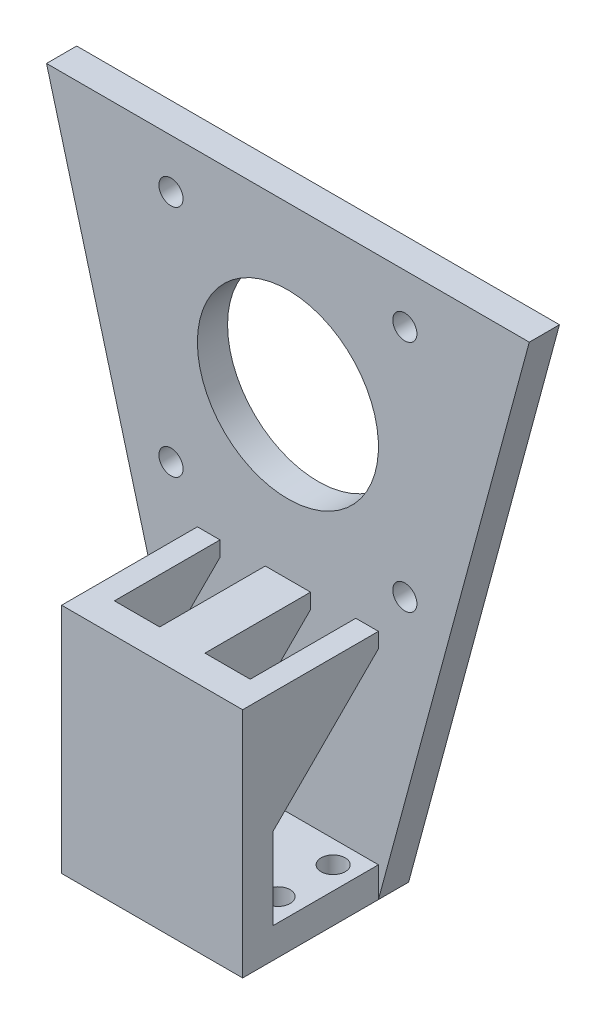
ISO-10303-21;
HEADER;
FILE_DESCRIPTION(('STEP AP214'),'2;1');
FILE_NAME('part.step','',(''),(''),'','','');
FILE_SCHEMA(('AUTOMOTIVE_DESIGN { 1 0 10303 214 1 1 1 1 }'));
ENDSEC;
DATA;
#1=APPLICATION_CONTEXT('core data for automotive mechanical design processes');
#2=APPLICATION_PROTOCOL_DEFINITION('international standard','automotive_design',2000,#1);
#3=PRODUCT_CONTEXT('',#1,'mechanical');
#4=PRODUCT('Part','Part','',(#3));
#5=PRODUCT_RELATED_PRODUCT_CATEGORY('part','',(#4));
#6=PRODUCT_DEFINITION_FORMATION('','',#4);
#7=PRODUCT_DEFINITION_CONTEXT('part definition',#1,'design');
#8=PRODUCT_DEFINITION('design','',#6,#7);
#9=PRODUCT_DEFINITION_SHAPE('','',#8);
#10=(LENGTH_UNIT() NAMED_UNIT(*) SI_UNIT(.MILLI.,.METRE.));
#11=(NAMED_UNIT(*) PLANE_ANGLE_UNIT() SI_UNIT($,.RADIAN.));
#12=(NAMED_UNIT(*) SI_UNIT($,.STERADIAN.) SOLID_ANGLE_UNIT());
#13=UNCERTAINTY_MEASURE_WITH_UNIT(LENGTH_MEASURE(1.E-05),#10,'distance_accuracy_value','');
#14=(GEOMETRIC_REPRESENTATION_CONTEXT(3) GLOBAL_UNCERTAINTY_ASSIGNED_CONTEXT((#13)) GLOBAL_UNIT_ASSIGNED_CONTEXT((#10,
#11,#12)) REPRESENTATION_CONTEXT('',''));
#15=CARTESIAN_POINT('',(0.,0.,0.));
#16=DIRECTION('',(0.,0.,1.));
#17=DIRECTION('',(1.,0.,0.));
#18=AXIS2_PLACEMENT_3D('',#15,#16,#17);
#19=CARTESIAN_POINT('',(-21.2602916254693,28.8,0.));
#20=DIRECTION('',(0.,-0.707106781186548,-0.707106781186547));
#21=DIRECTION('',(0.,0.707106781186547,-0.707106781186548));
#22=AXIS2_PLACEMENT_3D('',#19,#20,#21);
#23=PLANE('',#22);
#24=DIRECTION('',(1.,0.,0.));
#25=VECTOR('',#24,1.);
#26=CARTESIAN_POINT('',(-21.2602916254693,14.8,14.));
#27=LINE('',#26,#25);
#28=CARTESIAN_POINT('',(21.,14.8,14.));
#29=VERTEX_POINT('',#28);
#30=CARTESIAN_POINT('',(24.,14.8,14.));
#31=VERTEX_POINT('',#30);
#32=EDGE_CURVE('E320',#29,#31,#27,.T.);
#33=ORIENTED_EDGE('',*,*,#32,.F.);
#34=DIRECTION('',(0.,-0.707106781186547,0.707106781186548));
#35=VECTOR('',#34,1.);
#36=CARTESIAN_POINT('',(21.,28.8,0.));
#37=LINE('',#36,#35);
#38=CARTESIAN_POINT('',(21.,28.8,0.));
#39=VERTEX_POINT('',#38);
#40=EDGE_CURVE('E183',#39,#29,#37,.T.);
#41=ORIENTED_EDGE('',*,*,#40,.F.);
#42=DIRECTION('',(1.,0.,0.));
#43=VECTOR('',#42,1.);
#44=CARTESIAN_POINT('',(-21.2602916254693,28.8,0.));
#45=LINE('',#44,#43);
#46=CARTESIAN_POINT('',(24.,28.8,0.));
#47=VERTEX_POINT('',#46);
#48=EDGE_CURVE('E181',#39,#47,#45,.T.);
#49=ORIENTED_EDGE('',*,*,#48,.T.);
#50=DIRECTION('',(0.,0.707106781186547,-0.707106781186548));
#51=VECTOR('',#50,1.);
#52=CARTESIAN_POINT('',(24.,28.8,0.));
#53=LINE('',#52,#51);
#54=EDGE_CURVE('E319',#31,#47,#53,.T.);
#55=ORIENTED_EDGE('',*,*,#54,.F.);
#56=EDGE_LOOP('',(#33,#41,#49,#55));
#57=FACE_BOUND('',#56,.T.);
#58=ADVANCED_FACE('F41',(#57),#23,.T.);
#59=DIRECTION('',(0.,-0.707106781186547,0.707106781186548));
#60=VECTOR('',#59,1.);
#61=CARTESIAN_POINT('',(15.,28.8,0.));
#62=LINE('',#61,#60);
#63=CARTESIAN_POINT('',(15.,28.8,0.));
#64=VERTEX_POINT('',#63);
#65=CARTESIAN_POINT('',(15.,14.8,14.));
#66=VERTEX_POINT('',#65);
#67=EDGE_CURVE('E58',#64,#66,#62,.T.);
#68=ORIENTED_EDGE('',*,*,#67,.T.);
#69=CARTESIAN_POINT('',(9.,14.8,14.));
#70=VERTEX_POINT('',#69);
#71=EDGE_CURVE('E322',#70,#66,#27,.T.);
#72=ORIENTED_EDGE('',*,*,#71,.F.);
#73=DIRECTION('',(0.,-0.707106781186547,0.707106781186548));
#74=VECTOR('',#73,1.);
#75=CARTESIAN_POINT('',(9.,28.8,0.));
#76=LINE('',#75,#74);
#77=CARTESIAN_POINT('',(9.,28.8,0.));
#78=VERTEX_POINT('',#77);
#79=EDGE_CURVE('E349',#78,#70,#76,.T.);
#80=ORIENTED_EDGE('',*,*,#79,.F.);
#81=EDGE_CURVE('E333',#78,#64,#45,.T.);
#82=ORIENTED_EDGE('',*,*,#81,.T.);
#83=EDGE_LOOP('',(#68,#72,#80,#82));
#84=FACE_BOUND('',#83,.T.);
#85=ADVANCED_FACE('F347',(#84),#23,.T.);
#86=CARTESIAN_POINT('',(0.,4.,0.));
#87=DIRECTION('',(1.,0.,0.));
#88=DIRECTION('',(0.,0.,-1.));
#89=AXIS2_PLACEMENT_3D('',#86,#87,#88);
#90=PLANE('',#89);
#91=DIRECTION('',(0.,0.,1.));
#92=VECTOR('',#91,1.);
#93=CARTESIAN_POINT('',(0.,30.8,14.));
#94=LINE('',#93,#92);
#95=CARTESIAN_POINT('',(0.,30.8,0.));
#96=VERTEX_POINT('',#95);
#97=CARTESIAN_POINT('',(0.,30.8,18.));
#98=VERTEX_POINT('',#97);
#99=EDGE_CURVE('E208',#96,#98,#94,.T.);
#100=ORIENTED_EDGE('',*,*,#99,.F.);
#101=DIRECTION('',(0.,1.,0.));
#102=VECTOR('',#101,1.);
#103=CARTESIAN_POINT('',(0.,30.8,0.));
#104=LINE('',#103,#102);
#105=CARTESIAN_POINT('',(0.,28.8,0.));
#106=VERTEX_POINT('',#105);
#107=EDGE_CURVE('E198',#106,#96,#104,.T.);
#108=ORIENTED_EDGE('',*,*,#107,.F.);
#109=DIRECTION('',(0.,0.707106781186547,-0.707106781186548));
#110=VECTOR('',#109,1.);
#111=CARTESIAN_POINT('',(0.,28.8,0.));
#112=LINE('',#111,#110);
#113=CARTESIAN_POINT('',(0.,14.8,14.));
#114=VERTEX_POINT('',#113);
#115=EDGE_CURVE('E327',#114,#106,#112,.T.);
#116=ORIENTED_EDGE('',*,*,#115,.F.);
#117=DIRECTION('',(0.,-1.,0.));
#118=VECTOR('',#117,1.);
#119=CARTESIAN_POINT('',(0.,74.,14.));
#120=LINE('',#119,#118);
#121=CARTESIAN_POINT('',(0.,4.,14.));
#122=VERTEX_POINT('',#121);
#123=EDGE_CURVE('E246',#114,#122,#120,.T.);
#124=ORIENTED_EDGE('',*,*,#123,.T.);
#125=DIRECTION('',(0.,0.,1.));
#126=VECTOR('',#125,1.);
#127=CARTESIAN_POINT('',(0.,4.,0.));
#128=LINE('',#127,#126);
#129=CARTESIAN_POINT('',(0.,4.,0.));
#130=VERTEX_POINT('',#129);
#131=EDGE_CURVE('E50',#130,#122,#128,.T.);
#132=ORIENTED_EDGE('',*,*,#131,.F.);
#133=DIRECTION('',(0.,1.,0.));
#134=VECTOR('',#133,1.);
#135=CARTESIAN_POINT('',(0.,4.,0.));
#136=LINE('',#135,#134);
#137=CARTESIAN_POINT('',(0.,0.,0.));
#138=VERTEX_POINT('',#137);
#139=EDGE_CURVE('E241',#138,#130,#136,.T.);
#140=ORIENTED_EDGE('',*,*,#139,.F.);
#141=DIRECTION('',(0.,0.,1.));
#142=VECTOR('',#141,1.);
#143=CARTESIAN_POINT('',(0.,0.,0.));
#144=LINE('',#143,#142);
#145=CARTESIAN_POINT('',(0.,0.,18.));
#146=VERTEX_POINT('',#145);
#147=EDGE_CURVE('E290',#138,#146,#144,.T.);
#148=ORIENTED_EDGE('',*,*,#147,.T.);
#149=DIRECTION('',(0.,-1.,0.));
#150=VECTOR('',#149,1.);
#151=CARTESIAN_POINT('',(0.,4.,18.));
#152=LINE('',#151,#150);
#153=EDGE_CURVE('E250',#98,#146,#152,.T.);
#154=ORIENTED_EDGE('',*,*,#153,.F.);
#155=EDGE_LOOP('',(#100,#108,#116,#124,#132,#140,#148,#154));
#156=FACE_BOUND('',#155,.T.);
#157=ADVANCED_FACE('F43',(#156),#90,.F.);
#158=CARTESIAN_POINT('',(24.,4.,0.));
#159=DIRECTION('',(-1.,0.,0.));
#160=DIRECTION('',(0.,0.,1.));
#161=AXIS2_PLACEMENT_3D('',#158,#159,#160);
#162=PLANE('',#161);
#163=DIRECTION('',(0.,0.,-1.));
#164=VECTOR('',#163,1.);
#165=CARTESIAN_POINT('',(24.,30.8,18.));
#166=LINE('',#165,#164);
#167=CARTESIAN_POINT('',(24.,30.8,18.));
#168=VERTEX_POINT('',#167);
#169=CARTESIAN_POINT('',(24.,30.8,0.));
#170=VERTEX_POINT('',#169);
#171=EDGE_CURVE('E195',#168,#170,#166,.T.);
#172=ORIENTED_EDGE('',*,*,#171,.F.);
#173=DIRECTION('',(0.,1.,0.));
#174=VECTOR('',#173,1.);
#175=CARTESIAN_POINT('',(24.,0.,18.));
#176=LINE('',#175,#174);
#177=CARTESIAN_POINT('',(24.,0.,18.));
#178=VERTEX_POINT('',#177);
#179=EDGE_CURVE('E255',#178,#168,#176,.T.);
#180=ORIENTED_EDGE('',*,*,#179,.F.);
#181=DIRECTION('',(0.,0.,-1.));
#182=VECTOR('',#181,1.);
#183=CARTESIAN_POINT('',(24.,0.,0.));
#184=LINE('',#183,#182);
#185=CARTESIAN_POINT('',(24.,0.,0.));
#186=VERTEX_POINT('',#185);
#187=EDGE_CURVE('E45',#178,#186,#184,.T.);
#188=ORIENTED_EDGE('',*,*,#187,.T.);
#189=DIRECTION('',(0.,-1.,0.));
#190=VECTOR('',#189,1.);
#191=CARTESIAN_POINT('',(24.,4.,0.));
#192=LINE('',#191,#190);
#193=CARTESIAN_POINT('',(24.,4.,0.));
#194=VERTEX_POINT('',#193);
#195=EDGE_CURVE('E234',#194,#186,#192,.T.);
#196=ORIENTED_EDGE('',*,*,#195,.F.);
#197=DIRECTION('',(0.,0.,-1.));
#198=VECTOR('',#197,1.);
#199=CARTESIAN_POINT('',(24.,4.,0.));
#200=LINE('',#199,#198);
#201=CARTESIAN_POINT('',(24.,4.,14.));
#202=VERTEX_POINT('',#201);
#203=EDGE_CURVE('E11',#202,#194,#200,.T.);
#204=ORIENTED_EDGE('',*,*,#203,.F.);
#205=DIRECTION('',(0.,-1.,0.));
#206=VECTOR('',#205,1.);
#207=CARTESIAN_POINT('',(24.,74.,14.));
#208=LINE('',#207,#206);
#209=EDGE_CURVE('E248',#31,#202,#208,.T.);
#210=ORIENTED_EDGE('',*,*,#209,.F.);
#211=ORIENTED_EDGE('',*,*,#54,.T.);
#212=DIRECTION('',(0.,1.,0.));
#213=VECTOR('',#212,1.);
#214=CARTESIAN_POINT('',(24.,30.8,0.));
#215=LINE('',#214,#213);
#216=EDGE_CURVE('E316',#47,#170,#215,.T.);
#217=ORIENTED_EDGE('',*,*,#216,.T.);
#218=EDGE_LOOP('',(#172,#180,#188,#196,#204,#210,#211,#217));
#219=FACE_BOUND('',#218,.T.);
#220=ADVANCED_FACE('F314',(#219),#162,.F.);
#221=CARTESIAN_POINT('',(0.,0.,18.));
#222=DIRECTION('',(0.,0.,1.));
#223=DIRECTION('',(1.,0.,0.));
#224=AXIS2_PLACEMENT_3D('',#221,#222,#223);
#225=PLANE('',#224);
#226=ORIENTED_EDGE('',*,*,#179,.T.);
#227=DIRECTION('',(1.,0.,0.));
#228=VECTOR('',#227,1.);
#229=CARTESIAN_POINT('',(0.,30.8,18.));
#230=LINE('',#229,#228);
#231=EDGE_CURVE('E211',#98,#168,#230,.T.);
#232=ORIENTED_EDGE('',*,*,#231,.F.);
#233=ORIENTED_EDGE('',*,*,#153,.T.);
#234=DIRECTION('',(1.,0.,0.));
#235=VECTOR('',#234,1.);
#236=CARTESIAN_POINT('',(0.,0.,18.));
#237=LINE('',#236,#235);
#238=EDGE_CURVE('E252',#146,#178,#237,.T.);
#239=ORIENTED_EDGE('',*,*,#238,.T.);
#240=EDGE_LOOP('',(#226,#232,#233,#239));
#241=FACE_BOUND('',#240,.T.);
#242=ADVANCED_FACE('F312',(#241),#225,.T.);
#243=CARTESIAN_POINT('',(0.,74.,14.));
#244=DIRECTION('',(0.,0.,1.));
#245=DIRECTION('',(1.,0.,0.));
#246=AXIS2_PLACEMENT_3D('',#243,#244,#245);
#247=PLANE('',#246);
#248=ORIENTED_EDGE('',*,*,#123,.F.);
#249=CARTESIAN_POINT('',(3.,14.8,14.));
#250=VERTEX_POINT('',#249);
#251=EDGE_CURVE('E216',#114,#250,#27,.T.);
#252=ORIENTED_EDGE('',*,*,#251,.T.);
#253=DIRECTION('',(0.,1.,0.));
#254=VECTOR('',#253,1.);
#255=CARTESIAN_POINT('',(3.,30.8,14.));
#256=LINE('',#255,#254);
#257=CARTESIAN_POINT('',(3.,30.8,14.));
#258=VERTEX_POINT('',#257);
#259=EDGE_CURVE('E374',#250,#258,#256,.T.);
#260=ORIENTED_EDGE('',*,*,#259,.T.);
#261=DIRECTION('',(1.,0.,0.));
#262=VECTOR('',#261,1.);
#263=CARTESIAN_POINT('',(3.,30.8,14.));
#264=LINE('',#263,#262);
#265=CARTESIAN_POINT('',(9.,30.8,14.));
#266=VERTEX_POINT('',#265);
#267=EDGE_CURVE('E323',#258,#266,#264,.T.);
#268=ORIENTED_EDGE('',*,*,#267,.T.);
#269=DIRECTION('',(0.,1.,0.));
#270=VECTOR('',#269,1.);
#271=CARTESIAN_POINT('',(9.,30.8,14.));
#272=LINE('',#271,#270);
#273=EDGE_CURVE('E344',#70,#266,#272,.T.);
#274=ORIENTED_EDGE('',*,*,#273,.F.);
#275=ORIENTED_EDGE('',*,*,#71,.T.);
#276=DIRECTION('',(0.,1.,0.));
#277=VECTOR('',#276,1.);
#278=CARTESIAN_POINT('',(15.,30.8,14.));
#279=LINE('',#278,#277);
#280=CARTESIAN_POINT('',(15.,30.8,14.));
#281=VERTEX_POINT('',#280);
#282=EDGE_CURVE('E341',#66,#281,#279,.T.);
#283=ORIENTED_EDGE('',*,*,#282,.T.);
#284=DIRECTION('',(1.,0.,0.));
#285=VECTOR('',#284,1.);
#286=CARTESIAN_POINT('',(15.,30.8,14.));
#287=LINE('',#286,#285);
#288=CARTESIAN_POINT('',(21.,30.8,14.));
#289=VERTEX_POINT('',#288);
#290=EDGE_CURVE('E353',#281,#289,#287,.T.);
#291=ORIENTED_EDGE('',*,*,#290,.T.);
#292=DIRECTION('',(0.,1.,0.));
#293=VECTOR('',#292,1.);
#294=CARTESIAN_POINT('',(21.,30.8,14.));
#295=LINE('',#294,#293);
#296=EDGE_CURVE('E66',#29,#289,#295,.T.);
#297=ORIENTED_EDGE('',*,*,#296,.F.);
#298=ORIENTED_EDGE('',*,*,#32,.T.);
#299=ORIENTED_EDGE('',*,*,#209,.T.);
#300=DIRECTION('',(-1.,0.,0.));
#301=VECTOR('',#300,1.);
#302=CARTESIAN_POINT('',(0.,4.,14.));
#303=LINE('',#302,#301);
#304=EDGE_CURVE('E243',#202,#122,#303,.T.);
#305=ORIENTED_EDGE('',*,*,#304,.T.);
#306=EDGE_LOOP('',(#248,#252,#260,#268,#274,#275,#283,#291,#297,#298,#299,#305));
#307=FACE_BOUND('',#306,.T.);
#308=ADVANCED_FACE('F340',(#307),#247,.F.);
#309=CARTESIAN_POINT('',(0.,4.,0.));
#310=DIRECTION('',(0.,1.,0.));
#311=DIRECTION('',(0.,0.,1.));
#312=AXIS2_PLACEMENT_3D('',#309,#310,#311);
#313=PLANE('',#312);
#314=CARTESIAN_POINT('',(21.0000022628883,4.,10.3086308243728));
#315=DIRECTION('',(0.,1.,0.));
#316=DIRECTION('',(0.,0.,1.));
#317=AXIS2_PLACEMENT_3D('',#314,#315,#316);
#318=CIRCLE('',#317,1.6);
#319=CARTESIAN_POINT('',(21.0000022628883,4.,11.9086308243728));
#320=VERTEX_POINT('',#319);
#321=EDGE_CURVE('E275',#320,#320,#318,.T.);
#322=ORIENTED_EDGE('',*,*,#321,.F.);
#323=EDGE_LOOP('',(#322));
#324=FACE_BOUND('',#323,.T.);
#325=CARTESIAN_POINT('',(3.,4.,3.00000000000032));
#326=DIRECTION('',(0.,1.,0.));
#327=DIRECTION('',(0.,0.,1.));
#328=AXIS2_PLACEMENT_3D('',#325,#326,#327);
#329=CIRCLE('',#328,1.6);
#330=CARTESIAN_POINT('',(3.,4.,4.60000000000032));
#331=VERTEX_POINT('',#330);
#332=EDGE_CURVE('E287',#331,#331,#329,.T.);
#333=ORIENTED_EDGE('',*,*,#332,.F.);
#334=EDGE_LOOP('',(#333));
#335=FACE_BOUND('',#334,.T.);
#336=CARTESIAN_POINT('',(3.0000022628883,4.,11.));
#337=DIRECTION('',(0.,1.,0.));
#338=DIRECTION('',(0.,0.,1.));
#339=AXIS2_PLACEMENT_3D('',#336,#337,#338);
#340=CIRCLE('',#339,1.6);
#341=CARTESIAN_POINT('',(3.0000022628883,4.,12.6));
#342=VERTEX_POINT('',#341);
#343=EDGE_CURVE('E281',#342,#342,#340,.T.);
#344=ORIENTED_EDGE('',*,*,#343,.F.);
#345=EDGE_LOOP('',(#344));
#346=FACE_BOUND('',#345,.T.);
#347=CARTESIAN_POINT('',(21.,4.,3.));
#348=DIRECTION('',(0.,1.,0.));
#349=DIRECTION('',(0.,0.,1.));
#350=AXIS2_PLACEMENT_3D('',#347,#348,#349);
#351=CIRCLE('',#350,1.6);
#352=CARTESIAN_POINT('',(21.,4.,4.6));
#353=VERTEX_POINT('',#352);
#354=EDGE_CURVE('E269',#353,#353,#351,.T.);
#355=ORIENTED_EDGE('',*,*,#354,.F.);
#356=EDGE_LOOP('',(#355));
#357=FACE_BOUND('',#356,.T.);
#358=ORIENTED_EDGE('',*,*,#131,.T.);
#359=ORIENTED_EDGE('',*,*,#304,.F.);
#360=ORIENTED_EDGE('',*,*,#203,.T.);
#361=DIRECTION('',(1.,0.,0.));
#362=VECTOR('',#361,1.);
#363=CARTESIAN_POINT('',(0.,4.,0.));
#364=LINE('',#363,#362);
#365=EDGE_CURVE('E258',#130,#194,#364,.T.);
#366=ORIENTED_EDGE('',*,*,#365,.F.);
#367=EDGE_LOOP('',(#358,#359,#360,#366));
#368=FACE_BOUND('',#367,.T.);
#369=ADVANCED_FACE('F414',(#324,#335,#346,#357,#368),#313,.T.);
#370=CARTESIAN_POINT('',(0.,0.,0.));
#371=DIRECTION('',(0.,1.,0.));
#372=DIRECTION('',(0.,0.,1.));
#373=AXIS2_PLACEMENT_3D('',#370,#371,#372);
#374=PLANE('',#373);
#375=DIRECTION('',(0.,0.,-1.));
#376=VECTOR('',#375,1.);
#377=CARTESIAN_POINT('',(24.,0.,0.));
#378=LINE('',#377,#376);
#379=CARTESIAN_POINT('',(24.,0.,-4.));
#380=VERTEX_POINT('',#379);
#381=EDGE_CURVE('E235',#186,#380,#378,.T.);
#382=ORIENTED_EDGE('',*,*,#381,.F.);
#383=ORIENTED_EDGE('',*,*,#187,.F.);
#384=ORIENTED_EDGE('',*,*,#238,.F.);
#385=ORIENTED_EDGE('',*,*,#147,.F.);
#386=CARTESIAN_POINT('',(0.,0.,-4.));
#387=VERTEX_POINT('',#386);
#388=EDGE_CURVE('E294',#387,#138,#144,.T.);
#389=ORIENTED_EDGE('',*,*,#388,.F.);
#390=DIRECTION('',(-1.,0.,0.));
#391=VECTOR('',#390,1.);
#392=CARTESIAN_POINT('',(24.,0.,-4.));
#393=LINE('',#392,#391);
#394=EDGE_CURVE('E263',#380,#387,#393,.T.);
#395=ORIENTED_EDGE('',*,*,#394,.F.);
#396=EDGE_LOOP('',(#382,#383,#384,#385,#389,#395));
#397=FACE_BOUND('',#396,.T.);
#398=CARTESIAN_POINT('',(21.,0.,3.));
#399=DIRECTION('',(0.,1.,0.));
#400=DIRECTION('',(0.,0.,1.));
#401=AXIS2_PLACEMENT_3D('',#398,#399,#400);
#402=CIRCLE('',#401,1.6);
#403=CARTESIAN_POINT('',(21.,0.,4.6));
#404=VERTEX_POINT('',#403);
#405=EDGE_CURVE('E268',#404,#404,#402,.T.);
#406=ORIENTED_EDGE('',*,*,#405,.T.);
#407=EDGE_LOOP('',(#406));
#408=FACE_BOUND('',#407,.T.);
#409=CARTESIAN_POINT('',(21.0000022628883,0.,10.3086308243728));
#410=DIRECTION('',(0.,1.,0.));
#411=DIRECTION('',(0.,0.,1.));
#412=AXIS2_PLACEMENT_3D('',#409,#410,#411);
#413=CIRCLE('',#412,1.6);
#414=CARTESIAN_POINT('',(21.0000022628883,0.,11.9086308243728));
#415=VERTEX_POINT('',#414);
#416=EDGE_CURVE('E272',#415,#415,#413,.T.);
#417=ORIENTED_EDGE('',*,*,#416,.T.);
#418=EDGE_LOOP('',(#417));
#419=FACE_BOUND('',#418,.T.);
#420=CARTESIAN_POINT('',(3.0000022628883,0.,11.));
#421=DIRECTION('',(0.,1.,0.));
#422=DIRECTION('',(0.,0.,1.));
#423=AXIS2_PLACEMENT_3D('',#420,#421,#422);
#424=CIRCLE('',#423,1.6);
#425=CARTESIAN_POINT('',(3.0000022628883,0.,12.6));
#426=VERTEX_POINT('',#425);
#427=EDGE_CURVE('E278',#426,#426,#424,.T.);
#428=ORIENTED_EDGE('',*,*,#427,.T.);
#429=EDGE_LOOP('',(#428));
#430=FACE_BOUND('',#429,.T.);
#431=CARTESIAN_POINT('',(3.,0.,3.00000000000032));
#432=DIRECTION('',(0.,1.,0.));
#433=DIRECTION('',(0.,0.,1.));
#434=AXIS2_PLACEMENT_3D('',#431,#432,#433);
#435=CIRCLE('',#434,1.6);
#436=CARTESIAN_POINT('',(3.,0.,4.60000000000032));
#437=VERTEX_POINT('',#436);
#438=EDGE_CURVE('E284',#437,#437,#435,.T.);
#439=ORIENTED_EDGE('',*,*,#438,.T.);
#440=EDGE_LOOP('',(#439));
#441=FACE_BOUND('',#440,.T.);
#442=ADVANCED_FACE('F308',(#397,#408,#419,#430,#441),#374,.F.);
#443=CARTESIAN_POINT('',(3.,4.,3.00000000000032));
#444=DIRECTION('',(0.,-1.,0.));
#445=DIRECTION('',(0.,0.,-1.));
#446=AXIS2_PLACEMENT_3D('',#443,#444,#445);
#447=CYLINDRICAL_SURFACE('',#446,1.6);
#448=ORIENTED_EDGE('',*,*,#332,.T.);
#449=EDGE_LOOP('',(#448));
#450=FACE_BOUND('',#449,.T.);
#451=ORIENTED_EDGE('',*,*,#438,.F.);
#452=EDGE_LOOP('',(#451));
#453=FACE_BOUND('',#452,.T.);
#454=ADVANCED_FACE('F438',(#450,#453),#447,.F.);
#455=CARTESIAN_POINT('',(3.0000022628883,4.,11.));
#456=DIRECTION('',(0.,-1.,0.));
#457=DIRECTION('',(0.,0.,-1.));
#458=AXIS2_PLACEMENT_3D('',#455,#456,#457);
#459=CYLINDRICAL_SURFACE('',#458,1.6);
#460=ORIENTED_EDGE('',*,*,#343,.T.);
#461=EDGE_LOOP('',(#460));
#462=FACE_BOUND('',#461,.T.);
#463=ORIENTED_EDGE('',*,*,#427,.F.);
#464=EDGE_LOOP('',(#463));
#465=FACE_BOUND('',#464,.T.);
#466=ADVANCED_FACE('F434',(#462,#465),#459,.F.);
#467=CARTESIAN_POINT('',(21.0000022628883,4.,10.3086308243728));
#468=DIRECTION('',(0.,-1.,0.));
#469=DIRECTION('',(0.,0.,-1.));
#470=AXIS2_PLACEMENT_3D('',#467,#468,#469);
#471=CYLINDRICAL_SURFACE('',#470,1.6);
#472=ORIENTED_EDGE('',*,*,#321,.T.);
#473=EDGE_LOOP('',(#472));
#474=FACE_BOUND('',#473,.T.);
#475=ORIENTED_EDGE('',*,*,#416,.F.);
#476=EDGE_LOOP('',(#475));
#477=FACE_BOUND('',#476,.T.);
#478=ADVANCED_FACE('F430',(#474,#477),#471,.F.);
#479=CARTESIAN_POINT('',(21.,4.,3.));
#480=DIRECTION('',(0.,-1.,0.));
#481=DIRECTION('',(0.,0.,-1.));
#482=AXIS2_PLACEMENT_3D('',#479,#480,#481);
#483=CYLINDRICAL_SURFACE('',#482,1.6);
#484=ORIENTED_EDGE('',*,*,#354,.T.);
#485=EDGE_LOOP('',(#484));
#486=FACE_BOUND('',#485,.T.);
#487=ORIENTED_EDGE('',*,*,#405,.F.);
#488=EDGE_LOOP('',(#487));
#489=FACE_BOUND('',#488,.T.);
#490=ADVANCED_FACE('F426',(#486,#489),#483,.F.);
#491=CARTESIAN_POINT('',(0.,0.,-4.));
#492=DIRECTION('',(0.,0.,-1.));
#493=DIRECTION('',(-1.,0.,0.));
#494=AXIS2_PLACEMENT_3D('',#491,#492,#493);
#495=PLANE('',#494);
#496=CARTESIAN_POINT('',(27.5,67.5,-4.));
#497=DIRECTION('',(0.,0.,-1.));
#498=DIRECTION('',(-1.,0.,0.));
#499=AXIS2_PLACEMENT_3D('',#496,#497,#498);
#500=CIRCLE('',#499,1.60000000000001);
#501=CARTESIAN_POINT('',(25.9,67.5,-4.));
#502=VERTEX_POINT('',#501);
#503=EDGE_CURVE('E652',#502,#502,#500,.T.);
#504=ORIENTED_EDGE('',*,*,#503,.F.);
#505=EDGE_LOOP('',(#504));
#506=FACE_BOUND('',#505,.T.);
#507=CARTESIAN_POINT('',(12.,52.,-4.));
#508=DIRECTION('',(0.,0.,-1.));
#509=DIRECTION('',(-1.,0.,0.));
#510=AXIS2_PLACEMENT_3D('',#507,#508,#509);
#511=CIRCLE('',#510,12.);
#512=CARTESIAN_POINT('',(0.,52.,-4.));
#513=VERTEX_POINT('',#512);
#514=EDGE_CURVE('E660',#513,#513,#511,.T.);
#515=ORIENTED_EDGE('',*,*,#514,.F.);
#516=EDGE_LOOP('',(#515));
#517=FACE_BOUND('',#516,.T.);
#518=CARTESIAN_POINT('',(-3.5,67.5000000000004,-4.));
#519=DIRECTION('',(0.,0.,-1.));
#520=DIRECTION('',(-1.,0.,0.));
#521=AXIS2_PLACEMENT_3D('',#518,#519,#520);
#522=CIRCLE('',#521,1.59999999999999);
#523=CARTESIAN_POINT('',(-5.1,67.5000000000004,-4.));
#524=VERTEX_POINT('',#523);
#525=EDGE_CURVE('E689',#524,#524,#522,.T.);
#526=ORIENTED_EDGE('',*,*,#525,.F.);
#527=EDGE_LOOP('',(#526));
#528=FACE_BOUND('',#527,.T.);
#529=CARTESIAN_POINT('',(-3.50000000000044,36.5000000000004,-4.));
#530=DIRECTION('',(0.,0.,-1.));
#531=DIRECTION('',(-1.,0.,0.));
#532=AXIS2_PLACEMENT_3D('',#529,#530,#531);
#533=CIRCLE('',#532,1.6);
#534=CARTESIAN_POINT('',(-5.10000000000043,36.5000000000004,-4.));
#535=VERTEX_POINT('',#534);
#536=EDGE_CURVE('E666',#535,#535,#533,.T.);
#537=ORIENTED_EDGE('',*,*,#536,.F.);
#538=EDGE_LOOP('',(#537));
#539=FACE_BOUND('',#538,.T.);
#540=CARTESIAN_POINT('',(27.4999999999996,36.5,-4.));
#541=DIRECTION('',(0.,0.,-1.));
#542=DIRECTION('',(-1.,0.,0.));
#543=AXIS2_PLACEMENT_3D('',#540,#541,#542);
#544=CIRCLE('',#543,1.6);
#545=CARTESIAN_POINT('',(25.8999999999996,36.5,-4.));
#546=VERTEX_POINT('',#545);
#547=EDGE_CURVE('E663',#546,#546,#544,.T.);
#548=ORIENTED_EDGE('',*,*,#547,.F.);
#549=EDGE_LOOP('',(#548));
#550=FACE_BOUND('',#549,.T.);
#551=DIRECTION('',(-1.,0.,0.));
#552=VECTOR('',#551,1.);
#553=CARTESIAN_POINT('',(0.,74.,-4.));
#554=LINE('',#553,#552);
#555=CARTESIAN_POINT('',(44.,74.,-4.));
#556=VERTEX_POINT('',#555);
#557=CARTESIAN_POINT('',(-20.,74.,-4.));
#558=VERTEX_POINT('',#557);
#559=EDGE_CURVE('E261',#556,#558,#554,.T.);
#560=ORIENTED_EDGE('',*,*,#559,.F.);
#561=DIRECTION('',(-0.260909025142775,-0.965363393028266,0.));
#562=VECTOR('',#561,1.);
#563=CARTESIAN_POINT('',(44.,74.,-4.));
#564=LINE('',#563,#562);
#565=EDGE_CURVE('E219',#556,#380,#564,.T.);
#566=ORIENTED_EDGE('',*,*,#565,.T.);
#567=ORIENTED_EDGE('',*,*,#394,.T.);
#568=DIRECTION('',(-0.260909025142775,0.965363393028266,0.));
#569=VECTOR('',#568,1.);
#570=CARTESIAN_POINT('',(0.,0.,-4.));
#571=LINE('',#570,#569);
#572=EDGE_CURVE('E224',#387,#558,#571,.T.);
#573=ORIENTED_EDGE('',*,*,#572,.T.);
#574=EDGE_LOOP('',(#560,#566,#567,#573));
#575=FACE_BOUND('',#574,.T.);
#576=ADVANCED_FACE('F422',(#506,#517,#528,#539,#550,#575),#495,.T.);
#577=CARTESIAN_POINT('',(0.,74.,0.));
#578=DIRECTION('',(0.,0.,-1.));
#579=DIRECTION('',(-1.,0.,0.));
#580=AXIS2_PLACEMENT_3D('',#577,#578,#579);
#581=PLANE('',#580);
#582=CARTESIAN_POINT('',(27.5,67.5,0.));
#583=DIRECTION('',(0.,0.,-1.));
#584=DIRECTION('',(-1.,0.,0.));
#585=AXIS2_PLACEMENT_3D('',#582,#583,#584);
#586=CIRCLE('',#585,1.60000000000001);
#587=CARTESIAN_POINT('',(25.9,67.5,0.));
#588=VERTEX_POINT('',#587);
#589=EDGE_CURVE('E655',#588,#588,#586,.F.);
#590=ORIENTED_EDGE('',*,*,#589,.F.);
#591=EDGE_LOOP('',(#590));
#592=FACE_BOUND('',#591,.T.);
#593=CARTESIAN_POINT('',(12.,52.,0.));
#594=DIRECTION('',(0.,0.,-1.));
#595=DIRECTION('',(-1.,0.,0.));
#596=AXIS2_PLACEMENT_3D('',#593,#594,#595);
#597=CIRCLE('',#596,12.);
#598=CARTESIAN_POINT('',(0.,52.,0.));
#599=VERTEX_POINT('',#598);
#600=EDGE_CURVE('E657',#599,#599,#597,.F.);
#601=ORIENTED_EDGE('',*,*,#600,.F.);
#602=EDGE_LOOP('',(#601));
#603=FACE_BOUND('',#602,.T.);
#604=CARTESIAN_POINT('',(-3.5,67.5000000000004,0.));
#605=DIRECTION('',(0.,0.,-1.));
#606=DIRECTION('',(-1.,0.,0.));
#607=AXIS2_PLACEMENT_3D('',#604,#605,#606);
#608=CIRCLE('',#607,1.59999999999999);
#609=CARTESIAN_POINT('',(-5.1,67.5000000000004,0.));
#610=VERTEX_POINT('',#609);
#611=EDGE_CURVE('E692',#610,#610,#608,.F.);
#612=ORIENTED_EDGE('',*,*,#611,.F.);
#613=EDGE_LOOP('',(#612));
#614=FACE_BOUND('',#613,.T.);
#615=CARTESIAN_POINT('',(-3.50000000000044,36.5000000000004,0.));
#616=DIRECTION('',(0.,0.,-1.));
#617=DIRECTION('',(-1.,0.,0.));
#618=AXIS2_PLACEMENT_3D('',#615,#616,#617);
#619=CIRCLE('',#618,1.6);
#620=CARTESIAN_POINT('',(-5.10000000000043,36.5000000000004,0.));
#621=VERTEX_POINT('',#620);
#622=EDGE_CURVE('E685',#621,#621,#619,.F.);
#623=ORIENTED_EDGE('',*,*,#622,.F.);
#624=EDGE_LOOP('',(#623));
#625=FACE_BOUND('',#624,.T.);
#626=CARTESIAN_POINT('',(27.4999999999996,36.5,0.));
#627=DIRECTION('',(0.,0.,-1.));
#628=DIRECTION('',(-1.,0.,0.));
#629=AXIS2_PLACEMENT_3D('',#626,#627,#628);
#630=CIRCLE('',#629,1.6);
#631=CARTESIAN_POINT('',(25.8999999999996,36.5,0.));
#632=VERTEX_POINT('',#631);
#633=EDGE_CURVE('E190',#632,#632,#630,.F.);
#634=ORIENTED_EDGE('',*,*,#633,.F.);
#635=EDGE_LOOP('',(#634));
#636=FACE_BOUND('',#635,.T.);
#637=ORIENTED_EDGE('',*,*,#48,.F.);
#638=DIRECTION('',(0.,-1.,0.));
#639=VECTOR('',#638,1.);
#640=CARTESIAN_POINT('',(21.,30.8,0.));
#641=LINE('',#640,#639);
#642=CARTESIAN_POINT('',(21.,30.8,0.));
#643=VERTEX_POINT('',#642);
#644=EDGE_CURVE('E174',#643,#39,#641,.T.);
#645=ORIENTED_EDGE('',*,*,#644,.F.);
#646=DIRECTION('',(1.,0.,0.));
#647=VECTOR('',#646,1.);
#648=CARTESIAN_POINT('',(-21.2602916254693,30.8,0.));
#649=LINE('',#648,#647);
#650=EDGE_CURVE('E179',#643,#170,#649,.T.);
#651=ORIENTED_EDGE('',*,*,#650,.T.);
#652=ORIENTED_EDGE('',*,*,#216,.F.);
#653=EDGE_LOOP('',(#637,#645,#651,#652));
#654=FACE_BOUND('',#653,.T.);
#655=DIRECTION('',(0.,-1.,0.));
#656=VECTOR('',#655,1.);
#657=CARTESIAN_POINT('',(9.,30.8,0.));
#658=LINE('',#657,#656);
#659=CARTESIAN_POINT('',(9.,30.8,0.));
#660=VERTEX_POINT('',#659);
#661=EDGE_CURVE('E363',#660,#78,#658,.T.);
#662=ORIENTED_EDGE('',*,*,#661,.F.);
#663=CARTESIAN_POINT('',(15.,30.8,0.));
#664=VERTEX_POINT('',#663);
#665=EDGE_CURVE('E197',#660,#664,#649,.T.);
#666=ORIENTED_EDGE('',*,*,#665,.T.);
#667=DIRECTION('',(0.,-1.,0.));
#668=VECTOR('',#667,1.);
#669=CARTESIAN_POINT('',(15.,30.8,0.));
#670=LINE('',#669,#668);
#671=EDGE_CURVE('E351',#664,#64,#670,.T.);
#672=ORIENTED_EDGE('',*,*,#671,.T.);
#673=ORIENTED_EDGE('',*,*,#81,.F.);
#674=EDGE_LOOP('',(#662,#666,#672,#673));
#675=FACE_BOUND('',#674,.T.);
#676=CARTESIAN_POINT('',(3.,30.8,0.));
#677=VERTEX_POINT('',#676);
#678=EDGE_CURVE('E200',#96,#677,#649,.T.);
#679=ORIENTED_EDGE('',*,*,#678,.T.);
#680=DIRECTION('',(0.,-1.,0.));
#681=VECTOR('',#680,1.);
#682=CARTESIAN_POINT('',(3.,30.8,0.));
#683=LINE('',#682,#681);
#684=CARTESIAN_POINT('',(3.,28.8,0.));
#685=VERTEX_POINT('',#684);
#686=EDGE_CURVE('E370',#677,#685,#683,.T.);
#687=ORIENTED_EDGE('',*,*,#686,.T.);
#688=EDGE_CURVE('E203',#106,#685,#45,.T.);
#689=ORIENTED_EDGE('',*,*,#688,.F.);
#690=ORIENTED_EDGE('',*,*,#107,.T.);
#691=EDGE_LOOP('',(#679,#687,#689,#690));
#692=FACE_BOUND('',#691,.T.);
#693=ORIENTED_EDGE('',*,*,#365,.T.);
#694=ORIENTED_EDGE('',*,*,#195,.T.);
#695=DIRECTION('',(-0.260909025142775,-0.965363393028266,0.));
#696=VECTOR('',#695,1.);
#697=CARTESIAN_POINT('',(44.,74.,0.));
#698=LINE('',#697,#696);
#699=CARTESIAN_POINT('',(44.,74.,0.));
#700=VERTEX_POINT('',#699);
#701=EDGE_CURVE('E220',#700,#186,#698,.T.);
#702=ORIENTED_EDGE('',*,*,#701,.F.);
#703=DIRECTION('',(1.,0.,0.));
#704=VECTOR('',#703,1.);
#705=CARTESIAN_POINT('',(0.,74.,0.));
#706=LINE('',#705,#704);
#707=CARTESIAN_POINT('',(-20.,74.,0.));
#708=VERTEX_POINT('',#707);
#709=EDGE_CURVE('E259',#708,#700,#706,.T.);
#710=ORIENTED_EDGE('',*,*,#709,.F.);
#711=DIRECTION('',(-0.260909025142775,0.965363393028266,0.));
#712=VECTOR('',#711,1.);
#713=CARTESIAN_POINT('',(0.,0.,0.));
#714=LINE('',#713,#712);
#715=EDGE_CURVE('E223',#138,#708,#714,.T.);
#716=ORIENTED_EDGE('',*,*,#715,.F.);
#717=ORIENTED_EDGE('',*,*,#139,.T.);
#718=EDGE_LOOP('',(#693,#694,#702,#710,#716,#717));
#719=FACE_BOUND('',#718,.T.);
#720=ADVANCED_FACE('F175',(#592,#603,#614,#625,#636,#654,#675,#692,#719),#581,.F.);
#721=CARTESIAN_POINT('',(0.,74.,0.));
#722=DIRECTION('',(0.,-1.,0.));
#723=DIRECTION('',(0.,0.,-1.));
#724=AXIS2_PLACEMENT_3D('',#721,#722,#723);
#725=PLANE('',#724);
#726=ORIENTED_EDGE('',*,*,#709,.T.);
#727=DIRECTION('',(0.,0.,-1.));
#728=VECTOR('',#727,1.);
#729=CARTESIAN_POINT('',(44.,74.,0.));
#730=LINE('',#729,#728);
#731=EDGE_CURVE('E227',#700,#556,#730,.T.);
#732=ORIENTED_EDGE('',*,*,#731,.T.);
#733=ORIENTED_EDGE('',*,*,#559,.T.);
#734=DIRECTION('',(0.,0.,-1.));
#735=VECTOR('',#734,1.);
#736=CARTESIAN_POINT('',(-20.,74.,0.));
#737=LINE('',#736,#735);
#738=EDGE_CURVE('E231',#708,#558,#737,.T.);
#739=ORIENTED_EDGE('',*,*,#738,.F.);
#740=EDGE_LOOP('',(#726,#732,#733,#739));
#741=FACE_BOUND('',#740,.T.);
#742=ADVANCED_FACE('F410',(#741),#725,.F.);
#743=CARTESIAN_POINT('',(44.,74.,0.));
#744=DIRECTION('',(0.965363393028266,-0.260909025142775,0.));
#745=DIRECTION('',(0.260909025142775,0.965363393028266,0.));
#746=AXIS2_PLACEMENT_3D('',#743,#744,#745);
#747=PLANE('',#746);
#748=ORIENTED_EDGE('',*,*,#565,.F.);
#749=ORIENTED_EDGE('',*,*,#731,.F.);
#750=ORIENTED_EDGE('',*,*,#701,.T.);
#751=ORIENTED_EDGE('',*,*,#381,.T.);
#752=EDGE_LOOP('',(#748,#749,#750,#751));
#753=FACE_BOUND('',#752,.T.);
#754=ADVANCED_FACE('F407',(#753),#747,.T.);
#755=CARTESIAN_POINT('',(0.,0.,0.));
#756=DIRECTION('',(-0.965363393028266,-0.260909025142775,0.));
#757=DIRECTION('',(0.260909025142775,-0.965363393028266,0.));
#758=AXIS2_PLACEMENT_3D('',#755,#756,#757);
#759=PLANE('',#758);
#760=ORIENTED_EDGE('',*,*,#572,.F.);
#761=ORIENTED_EDGE('',*,*,#388,.T.);
#762=ORIENTED_EDGE('',*,*,#715,.T.);
#763=ORIENTED_EDGE('',*,*,#738,.T.);
#764=EDGE_LOOP('',(#760,#761,#762,#763));
#765=FACE_BOUND('',#764,.T.);
#766=ADVANCED_FACE('F404',(#765),#759,.T.);
#767=CARTESIAN_POINT('',(0.,30.8,0.));
#768=DIRECTION('',(0.,1.,0.));
#769=DIRECTION('',(0.,0.,1.));
#770=AXIS2_PLACEMENT_3D('',#767,#768,#769);
#771=PLANE('',#770);
#772=DIRECTION('',(0.,0.,-1.));
#773=VECTOR('',#772,1.);
#774=CARTESIAN_POINT('',(15.,30.8,14.));
#775=LINE('',#774,#773);
#776=EDGE_CURVE('E355',#281,#664,#775,.T.);
#777=ORIENTED_EDGE('',*,*,#776,.T.);
#778=ORIENTED_EDGE('',*,*,#665,.F.);
#779=DIRECTION('',(0.,0.,-1.));
#780=VECTOR('',#779,1.);
#781=CARTESIAN_POINT('',(9.,30.8,14.));
#782=LINE('',#781,#780);
#783=EDGE_CURVE('E360',#266,#660,#782,.T.);
#784=ORIENTED_EDGE('',*,*,#783,.F.);
#785=ORIENTED_EDGE('',*,*,#267,.F.);
#786=DIRECTION('',(0.,0.,-1.));
#787=VECTOR('',#786,1.);
#788=CARTESIAN_POINT('',(3.,30.8,14.));
#789=LINE('',#788,#787);
#790=EDGE_CURVE('E367',#258,#677,#789,.T.);
#791=ORIENTED_EDGE('',*,*,#790,.T.);
#792=ORIENTED_EDGE('',*,*,#678,.F.);
#793=ORIENTED_EDGE('',*,*,#99,.T.);
#794=ORIENTED_EDGE('',*,*,#231,.T.);
#795=ORIENTED_EDGE('',*,*,#171,.T.);
#796=ORIENTED_EDGE('',*,*,#650,.F.);
#797=DIRECTION('',(0.,0.,-1.));
#798=VECTOR('',#797,1.);
#799=CARTESIAN_POINT('',(21.,30.8,14.));
#800=LINE('',#799,#798);
#801=EDGE_CURVE('E184',#289,#643,#800,.T.);
#802=ORIENTED_EDGE('',*,*,#801,.F.);
#803=ORIENTED_EDGE('',*,*,#290,.F.);
#804=EDGE_LOOP('',(#777,#778,#784,#785,#791,#792,#793,#794,#795,#796,#802,#803));
#805=FACE_BOUND('',#804,.T.);
#806=ADVANCED_FACE('F193',(#805),#771,.T.);
#807=DIRECTION('',(0.,-0.707106781186547,0.707106781186548));
#808=VECTOR('',#807,1.);
#809=CARTESIAN_POINT('',(3.,28.8,0.));
#810=LINE('',#809,#808);
#811=EDGE_CURVE('E372',#685,#250,#810,.T.);
#812=ORIENTED_EDGE('',*,*,#811,.T.);
#813=ORIENTED_EDGE('',*,*,#251,.F.);
#814=ORIENTED_EDGE('',*,*,#115,.T.);
#815=ORIENTED_EDGE('',*,*,#688,.T.);
#816=EDGE_LOOP('',(#812,#813,#814,#815));
#817=FACE_BOUND('',#816,.T.);
#818=ADVANCED_FACE('F381',(#817),#23,.T.);
#819=CARTESIAN_POINT('',(3.,0.,0.));
#820=DIRECTION('',(-1.,0.,0.));
#821=DIRECTION('',(0.,0.,1.));
#822=AXIS2_PLACEMENT_3D('',#819,#820,#821);
#823=PLANE('',#822);
#824=ORIENTED_EDGE('',*,*,#790,.F.);
#825=ORIENTED_EDGE('',*,*,#259,.F.);
#826=ORIENTED_EDGE('',*,*,#811,.F.);
#827=ORIENTED_EDGE('',*,*,#686,.F.);
#828=EDGE_LOOP('',(#824,#825,#826,#827));
#829=FACE_BOUND('',#828,.T.);
#830=ADVANCED_FACE('F385',(#829),#823,.F.);
#831=CARTESIAN_POINT('',(9.,0.,0.));
#832=DIRECTION('',(-1.,0.,0.));
#833=DIRECTION('',(0.,0.,1.));
#834=AXIS2_PLACEMENT_3D('',#831,#832,#833);
#835=PLANE('',#834);
#836=ORIENTED_EDGE('',*,*,#783,.T.);
#837=ORIENTED_EDGE('',*,*,#661,.T.);
#838=ORIENTED_EDGE('',*,*,#79,.T.);
#839=ORIENTED_EDGE('',*,*,#273,.T.);
#840=EDGE_LOOP('',(#836,#837,#838,#839));
#841=FACE_BOUND('',#840,.T.);
#842=ADVANCED_FACE('F380',(#841),#835,.T.);
#843=CARTESIAN_POINT('',(15.,0.,0.));
#844=DIRECTION('',(-1.,0.,0.));
#845=DIRECTION('',(0.,0.,1.));
#846=AXIS2_PLACEMENT_3D('',#843,#844,#845);
#847=PLANE('',#846);
#848=ORIENTED_EDGE('',*,*,#776,.F.);
#849=ORIENTED_EDGE('',*,*,#282,.F.);
#850=ORIENTED_EDGE('',*,*,#67,.F.);
#851=ORIENTED_EDGE('',*,*,#671,.F.);
#852=EDGE_LOOP('',(#848,#849,#850,#851));
#853=FACE_BOUND('',#852,.T.);
#854=ADVANCED_FACE('F392',(#853),#847,.F.);
#855=CARTESIAN_POINT('',(21.,0.,0.));
#856=DIRECTION('',(-1.,0.,0.));
#857=DIRECTION('',(0.,0.,1.));
#858=AXIS2_PLACEMENT_3D('',#855,#856,#857);
#859=PLANE('',#858);
#860=ORIENTED_EDGE('',*,*,#801,.T.);
#861=ORIENTED_EDGE('',*,*,#644,.T.);
#862=ORIENTED_EDGE('',*,*,#40,.T.);
#863=ORIENTED_EDGE('',*,*,#296,.T.);
#864=EDGE_LOOP('',(#860,#861,#862,#863));
#865=FACE_BOUND('',#864,.T.);
#866=ADVANCED_FACE('F187',(#865),#859,.T.);
#867=CARTESIAN_POINT('',(27.4999999999996,36.5,18.001));
#868=DIRECTION('',(0.,0.,-1.));
#869=DIRECTION('',(-1.,0.,0.));
#870=AXIS2_PLACEMENT_3D('',#867,#868,#869);
#871=CYLINDRICAL_SURFACE('',#870,1.6);
#872=ORIENTED_EDGE('',*,*,#547,.T.);
#873=EDGE_LOOP('',(#872));
#874=FACE_BOUND('',#873,.T.);
#875=ORIENTED_EDGE('',*,*,#633,.T.);
#876=EDGE_LOOP('',(#875));
#877=FACE_BOUND('',#876,.T.);
#878=ADVANCED_FACE('F591',(#874,#877),#871,.F.);
#879=CARTESIAN_POINT('',(-3.50000000000044,36.5000000000004,18.001));
#880=DIRECTION('',(0.,0.,-1.));
#881=DIRECTION('',(-1.,0.,0.));
#882=AXIS2_PLACEMENT_3D('',#879,#880,#881);
#883=CYLINDRICAL_SURFACE('',#882,1.6);
#884=ORIENTED_EDGE('',*,*,#536,.T.);
#885=EDGE_LOOP('',(#884));
#886=FACE_BOUND('',#885,.T.);
#887=ORIENTED_EDGE('',*,*,#622,.T.);
#888=EDGE_LOOP('',(#887));
#889=FACE_BOUND('',#888,.T.);
#890=ADVANCED_FACE('F602',(#886,#889),#883,.F.);
#891=CARTESIAN_POINT('',(-3.5,67.5000000000004,18.001));
#892=DIRECTION('',(0.,0.,-1.));
#893=DIRECTION('',(-1.,0.,0.));
#894=AXIS2_PLACEMENT_3D('',#891,#892,#893);
#895=CYLINDRICAL_SURFACE('',#894,1.59999999999999);
#896=ORIENTED_EDGE('',*,*,#525,.T.);
#897=EDGE_LOOP('',(#896));
#898=FACE_BOUND('',#897,.T.);
#899=ORIENTED_EDGE('',*,*,#611,.T.);
#900=EDGE_LOOP('',(#899));
#901=FACE_BOUND('',#900,.T.);
#902=ADVANCED_FACE('F611',(#898,#901),#895,.F.);
#903=CARTESIAN_POINT('',(12.,52.,18.001));
#904=DIRECTION('',(0.,0.,-1.));
#905=DIRECTION('',(-1.,0.,0.));
#906=AXIS2_PLACEMENT_3D('',#903,#904,#905);
#907=CYLINDRICAL_SURFACE('',#906,12.);
#908=ORIENTED_EDGE('',*,*,#514,.T.);
#909=EDGE_LOOP('',(#908));
#910=FACE_BOUND('',#909,.T.);
#911=ORIENTED_EDGE('',*,*,#600,.T.);
#912=EDGE_LOOP('',(#911));
#913=FACE_BOUND('',#912,.T.);
#914=ADVANCED_FACE('F620',(#910,#913),#907,.F.);
#915=CARTESIAN_POINT('',(27.5,67.5,18.001));
#916=DIRECTION('',(0.,0.,-1.));
#917=DIRECTION('',(-1.,0.,0.));
#918=AXIS2_PLACEMENT_3D('',#915,#916,#917);
#919=CYLINDRICAL_SURFACE('',#918,1.60000000000001);
#920=ORIENTED_EDGE('',*,*,#503,.T.);
#921=EDGE_LOOP('',(#920));
#922=FACE_BOUND('',#921,.T.);
#923=ORIENTED_EDGE('',*,*,#589,.T.);
#924=EDGE_LOOP('',(#923));
#925=FACE_BOUND('',#924,.T.);
#926=ADVANCED_FACE('F629',(#922,#925),#919,.F.);
#927=CLOSED_SHELL('',(#58,#85,#157,#220,#242,#308,#369,#442,#454,#466,#478,#490,#576,#720,#742,
#754,#766,#806,#818,#830,#842,#854,#866,#878,#890,#902,#914,#926));
#928=MANIFOLD_SOLID_BREP('B2',#927);
#929=ADVANCED_BREP_SHAPE_REPRESENTATION('',(#18,#928),#14);
#930=SHAPE_DEFINITION_REPRESENTATION(#9,#929);
ENDSEC;
END-ISO-10303-21;
